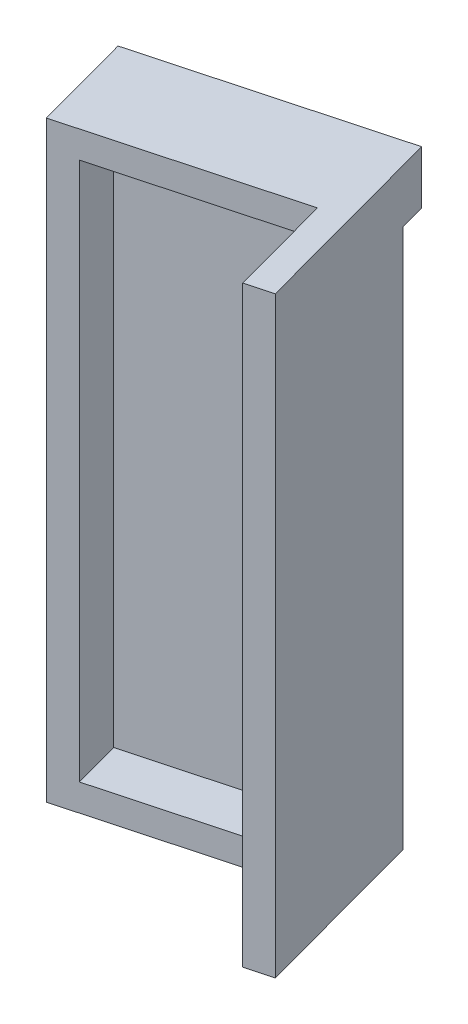
ISO-10303-21;
HEADER;
FILE_DESCRIPTION(('STEP AP214'),'2;1');
FILE_NAME('part.step','',(''),(''),'','','');
FILE_SCHEMA(('AUTOMOTIVE_DESIGN { 1 0 10303 214 1 1 1 1 }'));
ENDSEC;
DATA;
#1=APPLICATION_CONTEXT('core data for automotive mechanical design processes');
#2=APPLICATION_PROTOCOL_DEFINITION('international standard','automotive_design',2000,#1);
#3=PRODUCT_CONTEXT('',#1,'mechanical');
#4=PRODUCT('Part','Part','',(#3));
#5=PRODUCT_RELATED_PRODUCT_CATEGORY('part','',(#4));
#6=PRODUCT_DEFINITION_FORMATION('','',#4);
#7=PRODUCT_DEFINITION_CONTEXT('part definition',#1,'design');
#8=PRODUCT_DEFINITION('design','',#6,#7);
#9=PRODUCT_DEFINITION_SHAPE('','',#8);
#10=(LENGTH_UNIT() NAMED_UNIT(*) SI_UNIT(.MILLI.,.METRE.));
#11=(NAMED_UNIT(*) PLANE_ANGLE_UNIT() SI_UNIT($,.RADIAN.));
#12=(NAMED_UNIT(*) SI_UNIT($,.STERADIAN.) SOLID_ANGLE_UNIT());
#13=UNCERTAINTY_MEASURE_WITH_UNIT(LENGTH_MEASURE(1.E-05),#10,'distance_accuracy_value','');
#14=(GEOMETRIC_REPRESENTATION_CONTEXT(3) GLOBAL_UNCERTAINTY_ASSIGNED_CONTEXT((#13)) GLOBAL_UNIT_ASSIGNED_CONTEXT((#10,
#11,#12)) REPRESENTATION_CONTEXT('',''));
#15=CARTESIAN_POINT('',(0.,0.,0.));
#16=DIRECTION('',(0.,0.,1.));
#17=DIRECTION('',(1.,0.,0.));
#18=AXIS2_PLACEMENT_3D('',#15,#16,#17);
#19=CARTESIAN_POINT('',(1.37485246306783,0.,5.08507075381252));
#20=DIRECTION('',(0.26099907656251,0.,0.965339050299695));
#21=DIRECTION('',(0.965339050299695,0.,-0.26099907656251));
#22=AXIS2_PLACEMENT_3D('',#19,#20,#21);
#23=PLANE('',#22);
#24=DIRECTION('',(-0.965339050299695,0.,0.26099907656251));
#25=VECTOR('',#24,1.);
#26=CARTESIAN_POINT('',(-62.296803652968,34.2889465640938,22.3));
#27=LINE('',#26,#25);
#28=CARTESIAN_POINT('',(-35.2673102445766,34.2889465640938,14.9920258562497));
#29=VERTEX_POINT('',#28);
#30=CARTESIAN_POINT('',(-62.296803652968,34.2889465640938,22.3));
#31=VERTEX_POINT('',#30);
#32=EDGE_CURVE('E117',#29,#31,#27,.T.);
#33=ORIENTED_EDGE('',*,*,#32,.F.);
#34=DIRECTION('',(0.,1.,0.));
#35=VECTOR('',#34,1.);
#36=CARTESIAN_POINT('',(-35.2673102445766,-26.7110534359062,14.9920258562497));
#37=LINE('',#36,#35);
#38=CARTESIAN_POINT('',(-35.2673102445766,-26.7110534359062,14.9920258562497));
#39=VERTEX_POINT('',#38);
#40=EDGE_CURVE('E201',#39,#29,#37,.T.);
#41=ORIENTED_EDGE('',*,*,#40,.F.);
#42=DIRECTION('',(0.965339050299695,0.,-0.26099907656251));
#43=VECTOR('',#42,1.);
#44=CARTESIAN_POINT('',(-62.296803652968,-26.7110534359062,22.3));
#45=LINE('',#44,#43);
#46=CARTESIAN_POINT('',(-62.296803652968,-26.7110534359062,22.3));
#47=VERTEX_POINT('',#46);
#48=EDGE_CURVE('E172',#47,#39,#45,.T.);
#49=ORIENTED_EDGE('',*,*,#48,.F.);
#50=DIRECTION('',(0.,-1.,0.));
#51=VECTOR('',#50,1.);
#52=CARTESIAN_POINT('',(-62.296803652968,20.7902218953109,22.3));
#53=LINE('',#52,#51);
#54=EDGE_CURVE('E200',#31,#47,#53,.T.);
#55=ORIENTED_EDGE('',*,*,#54,.F.);
#56=EDGE_LOOP('',(#33,#41,#49,#55));
#57=FACE_BOUND('',#56,.T.);
#58=ADVANCED_FACE('F33',(#57),#23,.F.);
#59=CARTESIAN_POINT('',(3.59334461384917,0.,13.2904526813599));
#60=DIRECTION('',(0.26099907656251,0.,0.965339050299695));
#61=DIRECTION('',(0.965339050299695,0.,-0.26099907656251));
#62=AXIS2_PLACEMENT_3D('',#59,#60,#61);
#63=PLANE('',#62);
#64=DIRECTION('',(-0.965339050299695,0.,0.26099907656251));
#65=VECTOR('',#64,1.);
#66=CARTESIAN_POINT('',(-57.1340273987726,37.2389465640938,29.7093347440318));
#67=LINE('',#66,#65);
#68=CARTESIAN_POINT('',(-35.9448352446943,37.2389465640938,23.9804050134847));
#69=VERTEX_POINT('',#68);
#70=CARTESIAN_POINT('',(-57.1340273987726,37.2389465640938,29.7093347440318));
#71=VERTEX_POINT('',#70);
#72=EDGE_CURVE('E186',#69,#71,#67,.T.);
#73=ORIENTED_EDGE('',*,*,#72,.F.);
#74=DIRECTION('',(0.,-1.,0.));
#75=VECTOR('',#74,1.);
#76=CARTESIAN_POINT('',(-35.9448352446943,-26.7110534359062,23.9804050134847));
#77=LINE('',#76,#75);
#78=CARTESIAN_POINT('',(-35.9448352446943,40.2889465640938,23.9804050134846));
#79=VERTEX_POINT('',#78);
#80=EDGE_CURVE('E165',#79,#69,#77,.T.);
#81=ORIENTED_EDGE('',*,*,#80,.F.);
#82=DIRECTION('',(-0.965339050299695,0.,0.26099907656251));
#83=VECTOR('',#82,1.);
#84=CARTESIAN_POINT('',(-33.0488180937952,40.2889465640938,23.1974077837971));
#85=LINE('',#84,#83);
#86=CARTESIAN_POINT('',(-60.0783115021867,40.2889465640938,30.5053819275474));
#87=VERTEX_POINT('',#86);
#88=EDGE_CURVE('E194',#79,#87,#85,.T.);
#89=ORIENTED_EDGE('',*,*,#88,.T.);
#90=DIRECTION('',(0.,-1.,0.));
#91=VECTOR('',#90,1.);
#92=CARTESIAN_POINT('',(-60.0783115021867,40.2889465640938,30.5053819275474));
#93=LINE('',#92,#91);
#94=CARTESIAN_POINT('',(-60.0783115021867,-26.7110534359062,30.5053819275474));
#95=VERTEX_POINT('',#94);
#96=EDGE_CURVE('E191',#87,#95,#93,.T.);
#97=ORIENTED_EDGE('',*,*,#96,.T.);
#98=DIRECTION('',(0.965339050299695,0.,-0.26099907656251));
#99=VECTOR('',#98,1.);
#100=CARTESIAN_POINT('',(-60.0783115021867,-26.7110534359062,30.5053819275474));
#101=LINE('',#100,#99);
#102=CARTESIAN_POINT('',(-35.9448352446943,-26.7110534359062,23.9804050134847));
#103=VERTEX_POINT('',#102);
#104=EDGE_CURVE('E193',#95,#103,#101,.T.);
#105=ORIENTED_EDGE('',*,*,#104,.T.);
#106=CARTESIAN_POINT('',(-35.9448352446943,-23.6610534359062,23.9804050134847));
#107=VERTEX_POINT('',#106);
#108=EDGE_CURVE('E160',#107,#103,#77,.T.);
#109=ORIENTED_EDGE('',*,*,#108,.F.);
#110=DIRECTION('',(0.965339050299695,0.,-0.26099907656251));
#111=VECTOR('',#110,1.);
#112=CARTESIAN_POINT('',(-57.1340273987726,-23.6610534359062,29.7093347440318));
#113=LINE('',#112,#111);
#114=CARTESIAN_POINT('',(-57.1340273987726,-23.6610534359062,29.7093347440318));
#115=VERTEX_POINT('',#114);
#116=EDGE_CURVE('E183',#115,#107,#113,.T.);
#117=ORIENTED_EDGE('',*,*,#116,.F.);
#118=DIRECTION('',(0.,-1.,0.));
#119=VECTOR('',#118,1.);
#120=CARTESIAN_POINT('',(-57.1340273987726,-23.6610534359062,29.7093347440318));
#121=LINE('',#120,#119);
#122=EDGE_CURVE('E148',#71,#115,#121,.T.);
#123=ORIENTED_EDGE('',*,*,#122,.F.);
#124=EDGE_LOOP('',(#73,#81,#89,#97,#105,#109,#117,#123));
#125=FACE_BOUND('',#124,.T.);
#126=ADVANCED_FACE('F226',(#125),#63,.T.);
#127=CARTESIAN_POINT('',(-60.0783115021867,6.78894656409379,30.5053819275474));
#128=DIRECTION('',(0.965339050299695,0.,-0.26099907656251));
#129=DIRECTION('',(-0.26099907656251,0.,-0.965339050299695));
#130=AXIS2_PLACEMENT_3D('',#127,#128,#129);
#131=PLANE('',#130);
#132=DIRECTION('',(-0.26099907656251,0.,-0.965339050299695));
#133=VECTOR('',#132,1.);
#134=CARTESIAN_POINT('',(-60.0783115021867,40.2889465640938,30.5053819275474));
#135=LINE('',#134,#133);
#136=CARTESIAN_POINT('',(-63.0798008826555,40.2889465640938,19.4039828491009));
#137=VERTEX_POINT('',#136);
#138=EDGE_CURVE('E197',#87,#137,#135,.T.);
#139=ORIENTED_EDGE('',*,*,#138,.T.);
#140=DIRECTION('',(0.,1.,0.));
#141=VECTOR('',#140,1.);
#142=CARTESIAN_POINT('',(-63.0798008826555,40.2889465640938,19.4039828491009));
#143=LINE('',#142,#141);
#144=CARTESIAN_POINT('',(-63.0798008826555,34.2889465640938,19.4039828491009));
#145=VERTEX_POINT('',#144);
#146=EDGE_CURVE('E211',#145,#137,#143,.T.);
#147=ORIENTED_EDGE('',*,*,#146,.F.);
#148=DIRECTION('',(0.26099907656251,0.,0.965339050299695));
#149=VECTOR('',#148,1.);
#150=CARTESIAN_POINT('',(-63.0798008826555,34.2889465640938,19.4039828491009));
#151=LINE('',#150,#149);
#152=EDGE_CURVE('E203',#145,#31,#151,.T.);
#153=ORIENTED_EDGE('',*,*,#152,.T.);
#154=ORIENTED_EDGE('',*,*,#54,.T.);
#155=DIRECTION('',(-0.26099907656251,0.,-0.965339050299695));
#156=VECTOR('',#155,1.);
#157=CARTESIAN_POINT('',(-60.0783115021867,-26.7110534359062,30.5053819275474));
#158=LINE('',#157,#156);
#159=EDGE_CURVE('E171',#95,#47,#158,.T.);
#160=ORIENTED_EDGE('',*,*,#159,.F.);
#161=ORIENTED_EDGE('',*,*,#96,.F.);
#162=EDGE_LOOP('',(#139,#147,#153,#154,#160,#161));
#163=FACE_BOUND('',#162,.T.);
#164=ADVANCED_FACE('F232',(#163),#131,.F.);
#165=CARTESIAN_POINT('',(-60.0783115021867,-26.7110534359062,30.5053819275474));
#166=DIRECTION('',(0.,1.,0.));
#167=DIRECTION('',(-1.,0.,0.));
#168=AXIS2_PLACEMENT_3D('',#165,#166,#167);
#169=PLANE('',#168);
#170=ORIENTED_EDGE('',*,*,#48,.T.);
#171=DIRECTION('',(-0.26099907656251,0.,-0.965339050299695));
#172=VECTOR('',#171,1.);
#173=CARTESIAN_POINT('',(-33.0488180937952,-26.7110534359062,23.1974077837971));
#174=LINE('',#173,#172);
#175=CARTESIAN_POINT('',(-29.9168291750451,-26.7110534359062,34.7814763873935));
#176=VERTEX_POINT('',#175);
#177=EDGE_CURVE('E133',#176,#39,#174,.T.);
#178=ORIENTED_EDGE('',*,*,#177,.F.);
#179=DIRECTION('',(0.965339050299695,0.,-0.260999076562511));
#180=VECTOR('',#179,1.);
#181=CARTESIAN_POINT('',(-29.9168291750451,-26.7110534359062,34.7814763873935));
#182=LINE('',#181,#180);
#183=CARTESIAN_POINT('',(-32.8128463259442,-26.7110534359062,35.564473617081));
#184=VERTEX_POINT('',#183);
#185=EDGE_CURVE('E158',#184,#176,#182,.T.);
#186=ORIENTED_EDGE('',*,*,#185,.F.);
#187=DIRECTION('',(-0.26099907656251,0.,-0.965339050299695));
#188=VECTOR('',#187,1.);
#189=CARTESIAN_POINT('',(-32.8128463259442,-26.7110534359062,35.564473617081));
#190=LINE('',#189,#188);
#191=EDGE_CURVE('E169',#184,#103,#190,.T.);
#192=ORIENTED_EDGE('',*,*,#191,.T.);
#193=ORIENTED_EDGE('',*,*,#104,.F.);
#194=ORIENTED_EDGE('',*,*,#159,.T.);
#195=EDGE_LOOP('',(#170,#178,#186,#192,#193,#194));
#196=FACE_BOUND('',#195,.T.);
#197=ADVANCED_FACE('F236',(#196),#169,.F.);
#198=CARTESIAN_POINT('',(-33.0488180937952,-26.7110534359062,23.1974077837971));
#199=DIRECTION('',(-0.965339050299695,0.,0.26099907656251));
#200=DIRECTION('',(0.26099907656251,0.,0.965339050299695));
#201=AXIS2_PLACEMENT_3D('',#198,#199,#200);
#202=PLANE('',#201);
#203=ORIENTED_EDGE('',*,*,#40,.T.);
#204=DIRECTION('',(0.26099907656251,0.,0.965339050299695));
#205=VECTOR('',#204,1.);
#206=CARTESIAN_POINT('',(-36.0503074742641,34.2889465640938,12.0960087053506));
#207=LINE('',#206,#205);
#208=CARTESIAN_POINT('',(-36.0503074742641,34.2889465640938,12.0960087053506));
#209=VERTEX_POINT('',#208);
#210=EDGE_CURVE('E209',#209,#29,#207,.T.);
#211=ORIENTED_EDGE('',*,*,#210,.F.);
#212=DIRECTION('',(0.,-1.,0.));
#213=VECTOR('',#212,1.);
#214=CARTESIAN_POINT('',(-36.0503074742641,40.2889465640938,12.0960087053506));
#215=LINE('',#214,#213);
#216=CARTESIAN_POINT('',(-36.0503074742641,40.2889465640938,12.0960087053506));
#217=VERTEX_POINT('',#216);
#218=EDGE_CURVE('E43',#217,#209,#215,.T.);
#219=ORIENTED_EDGE('',*,*,#218,.F.);
#220=DIRECTION('',(-0.26099907656251,0.,-0.965339050299695));
#221=VECTOR('',#220,1.);
#222=CARTESIAN_POINT('',(-33.0488180937952,40.2889465640938,23.1974077837971));
#223=LINE('',#222,#221);
#224=CARTESIAN_POINT('',(-29.9168291750451,40.2889465640938,34.7814763873935));
#225=VERTEX_POINT('',#224);
#226=EDGE_CURVE('E138',#225,#217,#223,.T.);
#227=ORIENTED_EDGE('',*,*,#226,.F.);
#228=DIRECTION('',(0.,1.,0.));
#229=VECTOR('',#228,1.);
#230=CARTESIAN_POINT('',(-29.9168291750451,-26.7110534359062,34.7814763873935));
#231=LINE('',#230,#229);
#232=EDGE_CURVE('E143',#176,#225,#231,.T.);
#233=ORIENTED_EDGE('',*,*,#232,.F.);
#234=ORIENTED_EDGE('',*,*,#177,.T.);
#235=EDGE_LOOP('',(#203,#211,#219,#227,#233,#234));
#236=FACE_BOUND('',#235,.T.);
#237=ADVANCED_FACE('F141',(#236),#202,.F.);
#238=CARTESIAN_POINT('',(-33.0488180937952,40.2889465640938,23.1974077837971));
#239=DIRECTION('',(0.,-1.,0.));
#240=DIRECTION('',(0.,0.,-1.));
#241=AXIS2_PLACEMENT_3D('',#238,#239,#240);
#242=PLANE('',#241);
#243=ORIENTED_EDGE('',*,*,#226,.T.);
#244=DIRECTION('',(0.965339050299695,0.,-0.26099907656251));
#245=VECTOR('',#244,1.);
#246=CARTESIAN_POINT('',(-63.0798008826555,40.2889465640938,19.4039828491009));
#247=LINE('',#246,#245);
#248=EDGE_CURVE('E215',#137,#217,#247,.T.);
#249=ORIENTED_EDGE('',*,*,#248,.F.);
#250=ORIENTED_EDGE('',*,*,#138,.F.);
#251=ORIENTED_EDGE('',*,*,#88,.F.);
#252=DIRECTION('',(-0.26099907656251,0.,-0.965339050299695));
#253=VECTOR('',#252,1.);
#254=CARTESIAN_POINT('',(-32.8128463259442,40.2889465640938,35.564473617081));
#255=LINE('',#254,#253);
#256=CARTESIAN_POINT('',(-32.8128463259442,40.2889465640938,35.564473617081));
#257=VERTEX_POINT('',#256);
#258=EDGE_CURVE('E155',#257,#79,#255,.T.);
#259=ORIENTED_EDGE('',*,*,#258,.F.);
#260=DIRECTION('',(-0.965339050299695,0.,0.260999076562511));
#261=VECTOR('',#260,1.);
#262=CARTESIAN_POINT('',(-29.9168291750451,40.2889465640938,34.7814763873935));
#263=LINE('',#262,#261);
#264=EDGE_CURVE('E151',#225,#257,#263,.T.);
#265=ORIENTED_EDGE('',*,*,#264,.F.);
#266=EDGE_LOOP('',(#243,#249,#250,#251,#259,#265));
#267=FACE_BOUND('',#266,.T.);
#268=ADVANCED_FACE('F152',(#267),#242,.F.);
#269=CARTESIAN_POINT('',(-58.5695223198664,-23.6610534359062,24.3999699673834));
#270=DIRECTION('',(-0.965339050299695,0.,0.26099907656251));
#271=DIRECTION('',(0.26099907656251,0.,0.965339050299695));
#272=AXIS2_PLACEMENT_3D('',#269,#270,#271);
#273=PLANE('',#272);
#274=ORIENTED_EDGE('',*,*,#122,.T.);
#275=DIRECTION('',(0.26099907656251,0.,0.965339050299695));
#276=VECTOR('',#275,1.);
#277=CARTESIAN_POINT('',(-58.5695223198664,-23.6610534359062,24.3999699673834));
#278=LINE('',#277,#276);
#279=CARTESIAN_POINT('',(-58.5695223198664,-23.6610534359062,24.3999699673834));
#280=VERTEX_POINT('',#279);
#281=EDGE_CURVE('E178',#280,#115,#278,.T.);
#282=ORIENTED_EDGE('',*,*,#281,.F.);
#283=DIRECTION('',(0.,-1.,0.));
#284=VECTOR('',#283,1.);
#285=CARTESIAN_POINT('',(-58.5695223198664,-23.6610534359062,24.3999699673834));
#286=LINE('',#285,#284);
#287=CARTESIAN_POINT('',(-58.5695223198664,37.2389465640938,24.3999699673834));
#288=VERTEX_POINT('',#287);
#289=EDGE_CURVE('E174',#288,#280,#286,.T.);
#290=ORIENTED_EDGE('',*,*,#289,.F.);
#291=DIRECTION('',(0.26099907656251,0.,0.965339050299695));
#292=VECTOR('',#291,1.);
#293=CARTESIAN_POINT('',(-58.5695223198664,37.2389465640938,24.3999699673834));
#294=LINE('',#293,#292);
#295=EDGE_CURVE('E86',#288,#71,#294,.T.);
#296=ORIENTED_EDGE('',*,*,#295,.T.);
#297=EDGE_LOOP('',(#274,#282,#290,#296));
#298=FACE_BOUND('',#297,.T.);
#299=ADVANCED_FACE('F245',(#298),#273,.F.);
#300=CARTESIAN_POINT('',(-58.5695223198664,37.2389465640938,24.3999699673834));
#301=DIRECTION('',(0.,1.,0.));
#302=DIRECTION('',(-1.,0.,0.));
#303=AXIS2_PLACEMENT_3D('',#300,#301,#302);
#304=PLANE('',#303);
#305=ORIENTED_EDGE('',*,*,#72,.T.);
#306=ORIENTED_EDGE('',*,*,#295,.F.);
#307=DIRECTION('',(-0.965339050299695,0.,0.26099907656251));
#308=VECTOR('',#307,1.);
#309=CARTESIAN_POINT('',(-58.5695223198664,37.2389465640938,24.3999699673834));
#310=LINE('',#309,#308);
#311=CARTESIAN_POINT('',(-37.3803301657881,37.2389465640938,18.6710402368363));
#312=VERTEX_POINT('',#311);
#313=EDGE_CURVE('E78',#312,#288,#310,.T.);
#314=ORIENTED_EDGE('',*,*,#313,.F.);
#315=DIRECTION('',(0.26099907656251,0.,0.965339050299695));
#316=VECTOR('',#315,1.);
#317=CARTESIAN_POINT('',(-37.3803301657881,37.2389465640938,18.6710402368363));
#318=LINE('',#317,#316);
#319=EDGE_CURVE('E185',#312,#69,#318,.T.);
#320=ORIENTED_EDGE('',*,*,#319,.T.);
#321=EDGE_LOOP('',(#305,#306,#314,#320));
#322=FACE_BOUND('',#321,.T.);
#323=ADVANCED_FACE('F219',(#322),#304,.F.);
#324=CARTESIAN_POINT('',(-58.5695223198664,-23.6610534359062,24.3999699673834));
#325=DIRECTION('',(0.,-1.,0.));
#326=DIRECTION('',(0.,0.,-1.));
#327=AXIS2_PLACEMENT_3D('',#324,#325,#326);
#328=PLANE('',#327);
#329=ORIENTED_EDGE('',*,*,#116,.T.);
#330=DIRECTION('',(0.26099907656251,0.,0.965339050299695));
#331=VECTOR('',#330,1.);
#332=CARTESIAN_POINT('',(-37.3803301657881,-23.6610534359062,18.6710402368363));
#333=LINE('',#332,#331);
#334=CARTESIAN_POINT('',(-37.3803301657881,-23.6610534359062,18.6710402368363));
#335=VERTEX_POINT('',#334);
#336=EDGE_CURVE('E168',#335,#107,#333,.T.);
#337=ORIENTED_EDGE('',*,*,#336,.F.);
#338=DIRECTION('',(0.965339050299695,0.,-0.26099907656251));
#339=VECTOR('',#338,1.);
#340=CARTESIAN_POINT('',(-58.5695223198664,-23.6610534359062,24.3999699673834));
#341=LINE('',#340,#339);
#342=EDGE_CURVE('E177',#280,#335,#341,.T.);
#343=ORIENTED_EDGE('',*,*,#342,.F.);
#344=ORIENTED_EDGE('',*,*,#281,.T.);
#345=EDGE_LOOP('',(#329,#337,#343,#344));
#346=FACE_BOUND('',#345,.T.);
#347=ADVANCED_FACE('F240',(#346),#328,.F.);
#348=CARTESIAN_POINT('',(2.15784969275536,0.,7.98108790471161));
#349=DIRECTION('',(-0.26099907656251,0.,-0.965339050299695));
#350=DIRECTION('',(-0.965339050299695,0.,0.26099907656251));
#351=AXIS2_PLACEMENT_3D('',#348,#349,#350);
#352=PLANE('',#351);
#353=ORIENTED_EDGE('',*,*,#289,.T.);
#354=ORIENTED_EDGE('',*,*,#342,.T.);
#355=DIRECTION('',(0.,1.,0.));
#356=VECTOR('',#355,1.);
#357=CARTESIAN_POINT('',(-37.3803301657881,37.2389465640938,18.6710402368363));
#358=LINE('',#357,#356);
#359=EDGE_CURVE('E37',#335,#312,#358,.T.);
#360=ORIENTED_EDGE('',*,*,#359,.T.);
#361=ORIENTED_EDGE('',*,*,#313,.T.);
#362=EDGE_LOOP('',(#353,#354,#360,#361));
#363=FACE_BOUND('',#362,.T.);
#364=ADVANCED_FACE('F242',(#363),#352,.F.);
#365=CARTESIAN_POINT('',(-32.8128463259442,-26.7110534359062,35.564473617081));
#366=DIRECTION('',(0.965339050299695,0.,-0.26099907656251));
#367=DIRECTION('',(-0.26099907656251,0.,-0.965339050299695));
#368=AXIS2_PLACEMENT_3D('',#365,#366,#367);
#369=PLANE('',#368);
#370=ORIENTED_EDGE('',*,*,#80,.T.);
#371=ORIENTED_EDGE('',*,*,#319,.F.);
#372=ORIENTED_EDGE('',*,*,#359,.F.);
#373=ORIENTED_EDGE('',*,*,#336,.T.);
#374=ORIENTED_EDGE('',*,*,#108,.T.);
#375=ORIENTED_EDGE('',*,*,#191,.F.);
#376=DIRECTION('',(0.,-1.,0.));
#377=VECTOR('',#376,1.);
#378=CARTESIAN_POINT('',(-32.8128463259442,-26.7110534359062,35.564473617081));
#379=LINE('',#378,#377);
#380=EDGE_CURVE('E125',#257,#184,#379,.T.);
#381=ORIENTED_EDGE('',*,*,#380,.F.);
#382=ORIENTED_EDGE('',*,*,#258,.T.);
#383=EDGE_LOOP('',(#370,#371,#372,#373,#374,#375,#381,#382));
#384=FACE_BOUND('',#383,.T.);
#385=ADVANCED_FACE('F224',(#384),#369,.F.);
#386=CARTESIAN_POINT('',(6.72533353259929,0.,24.8745212849562));
#387=DIRECTION('',(0.260999076562511,0.,0.965339050299695));
#388=DIRECTION('',(0.965339050299695,0.,-0.260999076562511));
#389=AXIS2_PLACEMENT_3D('',#386,#387,#388);
#390=PLANE('',#389);
#391=ORIENTED_EDGE('',*,*,#232,.T.);
#392=ORIENTED_EDGE('',*,*,#264,.T.);
#393=ORIENTED_EDGE('',*,*,#380,.T.);
#394=ORIENTED_EDGE('',*,*,#185,.T.);
#395=EDGE_LOOP('',(#391,#392,#393,#394));
#396=FACE_BOUND('',#395,.T.);
#397=ADVANCED_FACE('F157',(#396),#390,.T.);
#398=CARTESIAN_POINT('',(-63.0798008826555,34.2889465640938,19.4039828491009));
#399=DIRECTION('',(0.,1.,0.));
#400=DIRECTION('',(0.,0.,1.));
#401=AXIS2_PLACEMENT_3D('',#398,#399,#400);
#402=PLANE('',#401);
#403=ORIENTED_EDGE('',*,*,#32,.T.);
#404=ORIENTED_EDGE('',*,*,#152,.F.);
#405=DIRECTION('',(-0.965339050299695,0.,0.26099907656251));
#406=VECTOR('',#405,1.);
#407=CARTESIAN_POINT('',(-63.0798008826555,34.2889465640938,19.4039828491009));
#408=LINE('',#407,#406);
#409=EDGE_CURVE('E11',#209,#145,#408,.T.);
#410=ORIENTED_EDGE('',*,*,#409,.F.);
#411=ORIENTED_EDGE('',*,*,#210,.T.);
#412=EDGE_LOOP('',(#403,#404,#410,#411));
#413=FACE_BOUND('',#412,.T.);
#414=ADVANCED_FACE('F268',(#413),#402,.F.);
#415=CARTESIAN_POINT('',(0.5918552333803,0.,2.18905360291343));
#416=DIRECTION('',(0.26099907656251,0.,0.965339050299695));
#417=DIRECTION('',(0.965339050299695,0.,-0.26099907656251));
#418=AXIS2_PLACEMENT_3D('',#415,#416,#417);
#419=PLANE('',#418);
#420=ORIENTED_EDGE('',*,*,#146,.T.);
#421=ORIENTED_EDGE('',*,*,#248,.T.);
#422=ORIENTED_EDGE('',*,*,#218,.T.);
#423=ORIENTED_EDGE('',*,*,#409,.T.);
#424=EDGE_LOOP('',(#420,#421,#422,#423));
#425=FACE_BOUND('',#424,.T.);
#426=ADVANCED_FACE('F35',(#425),#419,.F.);
#427=CLOSED_SHELL('',(#58,#126,#164,#197,#237,#268,#299,#323,#347,#364,#385,#397,#414,#426));
#428=MANIFOLD_SOLID_BREP('B2',#427);
#429=ADVANCED_BREP_SHAPE_REPRESENTATION('',(#18,#428),#14);
#430=SHAPE_DEFINITION_REPRESENTATION(#9,#429);
ENDSEC;
END-ISO-10303-21;
